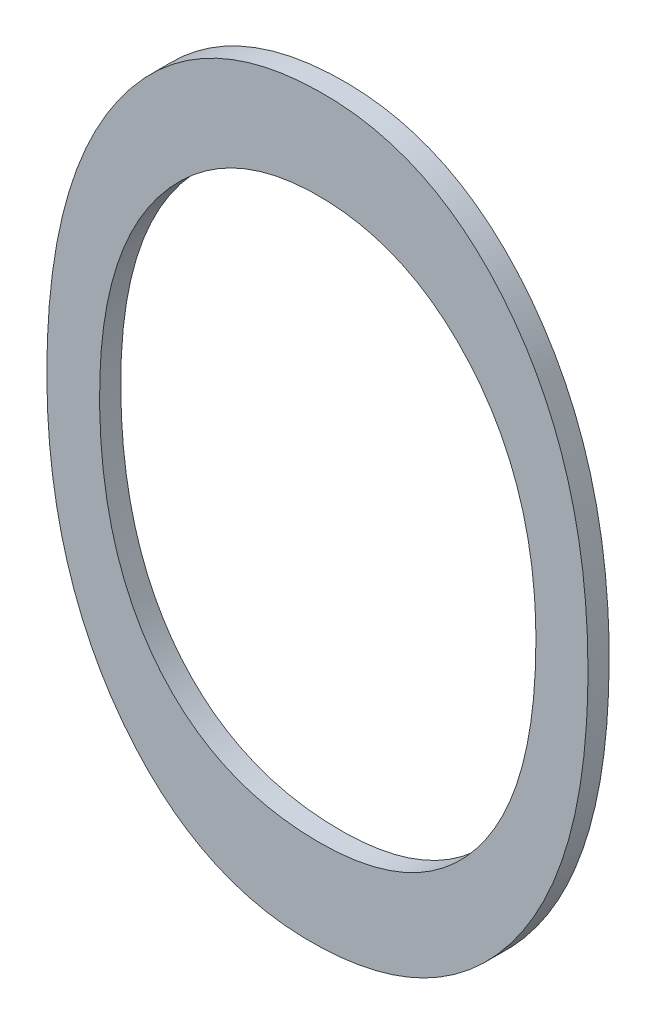
ISO-10303-21;
HEADER;
FILE_DESCRIPTION(('STEP AP214'),'2;1');
FILE_NAME('part.step','',(''),(''),'','','');
FILE_SCHEMA(('AUTOMOTIVE_DESIGN { 1 0 10303 214 1 1 1 1 }'));
ENDSEC;
DATA;
#1=APPLICATION_CONTEXT('core data for automotive mechanical design processes');
#2=APPLICATION_PROTOCOL_DEFINITION('international standard','automotive_design',2000,#1);
#3=PRODUCT_CONTEXT('',#1,'mechanical');
#4=PRODUCT('Part','Part','',(#3));
#5=PRODUCT_RELATED_PRODUCT_CATEGORY('part','',(#4));
#6=PRODUCT_DEFINITION_FORMATION('','',#4);
#7=PRODUCT_DEFINITION_CONTEXT('part definition',#1,'design');
#8=PRODUCT_DEFINITION('design','',#6,#7);
#9=PRODUCT_DEFINITION_SHAPE('','',#8);
#10=(LENGTH_UNIT() NAMED_UNIT(*) SI_UNIT(.MILLI.,.METRE.));
#11=(NAMED_UNIT(*) PLANE_ANGLE_UNIT() SI_UNIT($,.RADIAN.));
#12=(NAMED_UNIT(*) SI_UNIT($,.STERADIAN.) SOLID_ANGLE_UNIT());
#13=UNCERTAINTY_MEASURE_WITH_UNIT(LENGTH_MEASURE(1.E-05),#10,'distance_accuracy_value','');
#14=(GEOMETRIC_REPRESENTATION_CONTEXT(3) GLOBAL_UNCERTAINTY_ASSIGNED_CONTEXT((#13)) GLOBAL_UNIT_ASSIGNED_CONTEXT((#10,
#11,#12)) REPRESENTATION_CONTEXT('',''));
#15=CARTESIAN_POINT('',(0.,0.,0.));
#16=DIRECTION('',(0.,0.,1.));
#17=DIRECTION('',(1.,0.,0.));
#18=AXIS2_PLACEMENT_3D('',#15,#16,#17);
#19=CARTESIAN_POINT('',(-8.95983005625009,-22.770458436575,135.210489149433));
#20=DIRECTION('',(0.,0.,-1.));
#21=DIRECTION('',(0.,-1.,0.));
#22=AXIS2_PLACEMENT_3D('',#19,#20,#21);
#23=PLANE('',#22);
#24=CARTESIAN_POINT('',(-6.29001147151449,-57.2036649498082,135.210489149433));
#25=CARTESIAN_POINT('',(-6.29001147151449,-55.6376905619951,135.210489149433));
#26=CARTESIAN_POINT('',(-6.63960220039776,-54.3794038707565,135.210489149433));
#27=CARTESIAN_POINT('',(-8.03796444627411,-52.478205511647,135.210489149433));
#28=CARTESIAN_POINT('',(-8.936683522284,-52.0029061569471,135.210489149433));
#29=CARTESIAN_POINT('',(-11.2257835823802,-52.0029061569471,135.210489149433));
#30=CARTESIAN_POINT('',(-12.1771811794543,-52.4877831662802,135.210489149433));
#31=CARTESIAN_POINT('',(-13.6010836890156,-54.4272929883774,135.210489149433));
#32=CARTESIAN_POINT('',(-13.9570599991587,-55.7382577194471,135.210489149433));
#33=CARTESIAN_POINT('',(-13.9570599991587,-58.9228839979575,135.210489149433));
#34=CARTESIAN_POINT('',(-13.6090662372385,-60.1572263373725,135.210489149433));
#35=CARTESIAN_POINT('',(-12.2170884201205,-62.029690826383,135.210489149433));
#36=CARTESIAN_POINT('',(-11.3199653987747,-62.4978073738942,135.210489149433));
#37=CARTESIAN_POINT('',(-9.03725067973593,-62.4978073738942,135.210489149433));
#38=CARTESIAN_POINT('',(-8.08585302825645,-62.0249019505825,135.210489149433));
#39=CARTESIAN_POINT('',(-6.64917989098564,-60.1332815715753,135.210489149433));
#40=CARTESIAN_POINT('',(-6.29001147151449,-58.8414728636778,135.210489149433));
#41=CARTESIAN_POINT('',(-6.29001147151449,-57.2036649498082,135.210489149433));
#42=(BOUNDED_CURVE() B_SPLINE_CURVE(3,(#24,#25,#26,#27,#28,#29,#30,#31,#32,#33,#34,#35,#36,#37,
#38,#39,#40,#41),.UNSPECIFIED.,.T.,.F.) B_SPLINE_CURVE_WITH_KNOTS((4,2,2,2,2,2,2,2,4),(0.,
0.119769127317099,0.239538277576526,0.369404228018849,0.499270130659376,0.619725441865202,
0.740180683109994,0.870090292670561,1.),
.UNSPECIFIED.) CURVE() GEOMETRIC_REPRESENTATION_ITEM() RATIONAL_B_SPLINE_CURVE((1.,1.,1.,1.,1.,
1.,1.,1.,1.,1.,1.,1.,1.,1.,1.,1.,1.,1.)) REPRESENTATION_ITEM(''));
#43=CARTESIAN_POINT('',(-6.29001147151449,-57.2036649498082,135.210489149433));
#44=VERTEX_POINT('',#43);
#45=EDGE_CURVE('E11',#44,#44,#42,.T.);
#46=ORIENTED_EDGE('',*,*,#45,.T.);
#47=EDGE_LOOP('',(#46));
#48=FACE_BOUND('',#47,.T.);
#49=CARTESIAN_POINT('',(-7.02750395949526,-57.1964815551125,135.210489149433));
#50=CARTESIAN_POINT('',(-7.02750395949526,-58.4655430642311,135.210489149433));
#51=CARTESIAN_POINT('',(-7.3028661422954,-59.4532564299442,135.210489149433));
#52=CARTESIAN_POINT('',(-8.40431623413468,-60.8659851472965,135.210489149433));
#53=CARTESIAN_POINT('',(-9.1521845739667,-61.2191678005769,135.210489149433));
#54=CARTESIAN_POINT('',(-11.0741348188703,-61.2191678005769,135.210489149433));
#55=CARTESIAN_POINT('',(-11.8371686510976,-60.8779583881137,135.210489149433));
#56=CARTESIAN_POINT('',(-12.9354248849291,-59.5131172468882,135.210489149433));
#57=CARTESIAN_POINT('',(-13.2099896866587,-58.5469541985108,135.210489149433));
#58=CARTESIAN_POINT('',(-13.2099896866587,-56.0806647589427,135.210489149433));
#59=CARTESIAN_POINT('',(-12.9170677273582,-55.1085155913386,135.210489149433));
#60=CARTESIAN_POINT('',(-11.7453805625484,-53.6526862433177,135.210489149433));
#61=CARTESIAN_POINT('',(-11.0054936184378,-53.2887290986538,135.210489149433));
#62=CARTESIAN_POINT('',(-9.22082577439911,-53.2887290986538,135.210489149433));
#63=CARTESIAN_POINT('',(-8.48413167465649,-53.6431088090228,135.210489149433));
#64=CARTESIAN_POINT('',(-7.31882920586602,-55.0606264476446,135.210489149433));
#65=CARTESIAN_POINT('',(-7.02750395949526,-56.0088310750484,135.210489149433));
#66=CARTESIAN_POINT('',(-7.02750395949526,-57.1964815551125,135.210489149433));
#67=(BOUNDED_CURVE() B_SPLINE_CURVE(3,(#49,#50,#51,#52,#53,#54,#55,#56,#57,#58,#59,#60,#61,#62,
#63,#64,#65,#66),.UNSPECIFIED.,.T.,.F.) B_SPLINE_CURVE_WITH_KNOTS((4,2,2,2,2,2,2,2,4),(0.,
0.123691768703721,0.247383476288096,0.37525395335185,0.503124425762321,0.627565480981364,
0.752006596553877,0.876003296869422,1.),
.UNSPECIFIED.) CURVE() GEOMETRIC_REPRESENTATION_ITEM() RATIONAL_B_SPLINE_CURVE((1.,1.,1.,1.,1.,
1.,1.,1.,1.,1.,1.,1.,1.,1.,1.,1.,1.,1.)) REPRESENTATION_ITEM(''));
#68=CARTESIAN_POINT('',(-7.02750395949526,-57.1964815551125,135.210489149433));
#69=VERTEX_POINT('',#68);
#70=EDGE_CURVE('E46',#69,#69,#67,.T.);
#71=ORIENTED_EDGE('',*,*,#70,.T.);
#72=EDGE_LOOP('',(#71));
#73=FACE_BOUND('',#72,.T.);
#74=ADVANCED_FACE('F42',(#48,#73),#23,.F.);
#75=CARTESIAN_POINT('',(-6.29001147151449,-57.2036649498082,135.410489149433));
#76=CARTESIAN_POINT('',(-6.29001147151449,-55.6376905619951,135.410489149433));
#77=CARTESIAN_POINT('',(-6.63960220039776,-54.3794038707565,135.410489149433));
#78=CARTESIAN_POINT('',(-8.03796444627411,-52.478205511647,135.410489149433));
#79=CARTESIAN_POINT('',(-8.936683522284,-52.0029061569471,135.410489149433));
#80=CARTESIAN_POINT('',(-11.2257835823802,-52.0029061569471,135.410489149433));
#81=CARTESIAN_POINT('',(-12.1771811794543,-52.4877831662802,135.410489149433));
#82=CARTESIAN_POINT('',(-13.6010836890156,-54.4272929883774,135.410489149433));
#83=CARTESIAN_POINT('',(-13.9570599991587,-55.7382577194471,135.410489149433));
#84=CARTESIAN_POINT('',(-13.9570599991587,-58.9228839979575,135.410489149433));
#85=CARTESIAN_POINT('',(-13.6090662372385,-60.1572263373725,135.410489149433));
#86=CARTESIAN_POINT('',(-12.2170884201205,-62.029690826383,135.410489149433));
#87=CARTESIAN_POINT('',(-11.3199653987747,-62.4978073738942,135.410489149433));
#88=CARTESIAN_POINT('',(-9.03725067973593,-62.4978073738942,135.410489149433));
#89=CARTESIAN_POINT('',(-8.08585302825645,-62.0249019505825,135.410489149433));
#90=CARTESIAN_POINT('',(-6.64917989098564,-60.1332815715753,135.410489149433));
#91=CARTESIAN_POINT('',(-6.29001147151449,-58.8414728636778,135.410489149433));
#92=CARTESIAN_POINT('',(-6.29001147151449,-57.2036649498082,135.410489149433));
#93=(BOUNDED_CURVE() B_SPLINE_CURVE(3,(#75,#76,#77,#78,#79,#80,#81,#82,#83,#84,#85,#86,#87,#88,
#89,#90,#91,#92),.UNSPECIFIED.,.T.,.F.) B_SPLINE_CURVE_WITH_KNOTS((4,2,2,2,2,2,2,2,4),(0.,
0.119769127317099,0.239538277576526,0.369404228018849,0.499270130659376,0.619725441865202,
0.740180683109994,0.870090292670561,1.),
.UNSPECIFIED.) CURVE() GEOMETRIC_REPRESENTATION_ITEM() RATIONAL_B_SPLINE_CURVE((1.,1.,1.,1.,1.,
1.,1.,1.,1.,1.,1.,1.,1.,1.,1.,1.,1.,1.)) REPRESENTATION_ITEM(''));
#94=DIRECTION('',(0.,0.,-1.));
#95=VECTOR('',#94,1.);
#96=SURFACE_OF_LINEAR_EXTRUSION('',#93,#95);
#97=ORIENTED_EDGE('',*,*,#45,.F.);
#98=EDGE_LOOP('',(#97));
#99=FACE_BOUND('',#98,.T.);
#100=CARTESIAN_POINT('',(-6.29001147151449,-57.2036649498082,134.910489149433));
#101=CARTESIAN_POINT('',(-6.29001147151449,-58.8414728636778,134.910489149433));
#102=CARTESIAN_POINT('',(-6.64917989098564,-60.1332815715753,134.910489149433));
#103=CARTESIAN_POINT('',(-8.08585302825645,-62.0249019505825,134.910489149433));
#104=CARTESIAN_POINT('',(-9.03725067973593,-62.4978073738942,134.910489149433));
#105=CARTESIAN_POINT('',(-11.3199653987747,-62.4978073738942,134.910489149433));
#106=CARTESIAN_POINT('',(-12.2170884201205,-62.029690826383,134.910489149433));
#107=CARTESIAN_POINT('',(-13.6090662372385,-60.1572263373725,134.910489149433));
#108=CARTESIAN_POINT('',(-13.9570599991587,-58.9228839979575,134.910489149433));
#109=CARTESIAN_POINT('',(-13.9570599991587,-55.7382577194471,134.910489149433));
#110=CARTESIAN_POINT('',(-13.6010836890156,-54.4272929883774,134.910489149433));
#111=CARTESIAN_POINT('',(-12.1771811794543,-52.4877831662802,134.910489149433));
#112=CARTESIAN_POINT('',(-11.2257835823802,-52.0029061569471,134.910489149433));
#113=CARTESIAN_POINT('',(-8.936683522284,-52.0029061569471,134.910489149433));
#114=CARTESIAN_POINT('',(-8.03796444627411,-52.478205511647,134.910489149433));
#115=CARTESIAN_POINT('',(-6.63960220039776,-54.3794038707565,134.910489149433));
#116=CARTESIAN_POINT('',(-6.29001147151449,-55.6376905619951,134.910489149433));
#117=CARTESIAN_POINT('',(-6.29001147151449,-57.2036649498082,134.910489149433));
#118=(BOUNDED_CURVE() B_SPLINE_CURVE(3,(#100,#101,#102,#103,#104,#105,#106,#107,#108,#109,#110,
#111,#112,#113,#114,#115,#116,#117),.UNSPECIFIED.,.T.,.F.) B_SPLINE_CURVE_WITH_KNOTS((4,2,2,2,2,
2,2,2,4),(0.,0.129909707329439,0.259819316890006,0.380274558134798,0.500729869340624,
0.630595771981151,0.760461722423474,0.880230872682901,1.),
.UNSPECIFIED.) CURVE() GEOMETRIC_REPRESENTATION_ITEM() RATIONAL_B_SPLINE_CURVE((1.,1.,1.,1.,1.,
1.,1.,1.,1.,1.,1.,1.,1.,1.,1.,1.,1.,1.)) REPRESENTATION_ITEM(''));
#119=CARTESIAN_POINT('',(-6.29001147151449,-57.2036649498082,134.910489149433));
#120=VERTEX_POINT('',#119);
#121=EDGE_CURVE('E54',#120,#120,#118,.T.);
#122=ORIENTED_EDGE('',*,*,#121,.F.);
#123=EDGE_LOOP('',(#122));
#124=FACE_BOUND('',#123,.T.);
#125=ADVANCED_FACE('F119',(#99,#124),#96,.F.);
#126=CARTESIAN_POINT('',(-13.9570216698443,-57.4182560853678,134.910489149433));
#127=DIRECTION('',(0.,0.,1.));
#128=DIRECTION('',(1.,0.,0.));
#129=AXIS2_PLACEMENT_3D('',#126,#127,#128);
#130=PLANE('',#129);
#131=ORIENTED_EDGE('',*,*,#121,.T.);
#132=EDGE_LOOP('',(#131));
#133=FACE_BOUND('',#132,.T.);
#134=CARTESIAN_POINT('',(-7.02750395949526,-57.1964815551125,134.910489149433));
#135=CARTESIAN_POINT('',(-7.02750395949526,-56.0088310750484,134.910489149433));
#136=CARTESIAN_POINT('',(-7.31882920586602,-55.0606264476446,134.910489149433));
#137=CARTESIAN_POINT('',(-8.48413167465649,-53.6431088090228,134.910489149433));
#138=CARTESIAN_POINT('',(-9.22082577439911,-53.2887290986538,134.910489149433));
#139=CARTESIAN_POINT('',(-11.0054936184378,-53.2887290986538,134.910489149433));
#140=CARTESIAN_POINT('',(-11.7453805625484,-53.6526862433177,134.910489149433));
#141=CARTESIAN_POINT('',(-12.9170677273582,-55.1085155913386,134.910489149433));
#142=CARTESIAN_POINT('',(-13.2099896866587,-56.0806647589427,134.910489149433));
#143=CARTESIAN_POINT('',(-13.2099896866587,-58.5469541985108,134.910489149433));
#144=CARTESIAN_POINT('',(-12.9354248849291,-59.5131172468882,134.910489149433));
#145=CARTESIAN_POINT('',(-11.8371686510976,-60.8779583881137,134.910489149433));
#146=CARTESIAN_POINT('',(-11.0741348188703,-61.2191678005769,134.910489149433));
#147=CARTESIAN_POINT('',(-9.1521845739667,-61.2191678005769,134.910489149433));
#148=CARTESIAN_POINT('',(-8.40431623413468,-60.8659851472965,134.910489149433));
#149=CARTESIAN_POINT('',(-7.3028661422954,-59.4532564299442,134.910489149433));
#150=CARTESIAN_POINT('',(-7.02750395949526,-58.4655430642311,134.910489149433));
#151=CARTESIAN_POINT('',(-7.02750395949526,-57.1964815551125,134.910489149433));
#152=(BOUNDED_CURVE() B_SPLINE_CURVE(3,(#134,#135,#136,#137,#138,#139,#140,#141,#142,#143,#144,
#145,#146,#147,#148,#149,#150,#151),.UNSPECIFIED.,.T.,.F.) B_SPLINE_CURVE_WITH_KNOTS((4,2,2,2,2,
2,2,2,4),(0.,0.123996703130578,0.247993403446123,0.372434519018636,0.496875574237679,
0.62474604664815,0.752616523711904,0.876308231296279,1.),
.UNSPECIFIED.) CURVE() GEOMETRIC_REPRESENTATION_ITEM() RATIONAL_B_SPLINE_CURVE((1.,1.,1.,1.,1.,
1.,1.,1.,1.,1.,1.,1.,1.,1.,1.,1.,1.,1.)) REPRESENTATION_ITEM(''));
#153=CARTESIAN_POINT('',(-7.02750395949526,-57.1964815551125,134.910489149433));
#154=VERTEX_POINT('',#153);
#155=EDGE_CURVE('E77',#154,#154,#152,.T.);
#156=ORIENTED_EDGE('',*,*,#155,.T.);
#157=EDGE_LOOP('',(#156));
#158=FACE_BOUND('',#157,.T.);
#159=ADVANCED_FACE('F44',(#133,#158),#130,.F.);
#160=CARTESIAN_POINT('',(-7.02750395949526,-57.1964815551125,135.410489149433));
#161=CARTESIAN_POINT('',(-7.02750395949526,-58.4655430642311,135.410489149433));
#162=CARTESIAN_POINT('',(-7.3028661422954,-59.4532564299442,135.410489149433));
#163=CARTESIAN_POINT('',(-8.40431623413468,-60.8659851472965,135.410489149433));
#164=CARTESIAN_POINT('',(-9.1521845739667,-61.2191678005769,135.410489149433));
#165=CARTESIAN_POINT('',(-11.0741348188703,-61.2191678005769,135.410489149433));
#166=CARTESIAN_POINT('',(-11.8371686510976,-60.8779583881137,135.410489149433));
#167=CARTESIAN_POINT('',(-12.9354248849291,-59.5131172468882,135.410489149433));
#168=CARTESIAN_POINT('',(-13.2099896866587,-58.5469541985108,135.410489149433));
#169=CARTESIAN_POINT('',(-13.2099896866587,-56.0806647589427,135.410489149433));
#170=CARTESIAN_POINT('',(-12.9170677273582,-55.1085155913386,135.410489149433));
#171=CARTESIAN_POINT('',(-11.7453805625484,-53.6526862433177,135.410489149433));
#172=CARTESIAN_POINT('',(-11.0054936184378,-53.2887290986538,135.410489149433));
#173=CARTESIAN_POINT('',(-9.22082577439911,-53.2887290986538,135.410489149433));
#174=CARTESIAN_POINT('',(-8.48413167465649,-53.6431088090228,135.410489149433));
#175=CARTESIAN_POINT('',(-7.31882920586602,-55.0606264476446,135.410489149433));
#176=CARTESIAN_POINT('',(-7.02750395949526,-56.0088310750484,135.410489149433));
#177=CARTESIAN_POINT('',(-7.02750395949526,-57.1964815551125,135.410489149433));
#178=(BOUNDED_CURVE() B_SPLINE_CURVE(3,(#160,#161,#162,#163,#164,#165,#166,#167,#168,#169,#170,
#171,#172,#173,#174,#175,#176,#177),.UNSPECIFIED.,.T.,.F.) B_SPLINE_CURVE_WITH_KNOTS((4,2,2,2,2,
2,2,2,4),(0.,0.123691768703721,0.247383476288096,0.37525395335185,0.503124425762321,
0.627565480981364,0.752006596553877,0.876003296869422,1.),
.UNSPECIFIED.) CURVE() GEOMETRIC_REPRESENTATION_ITEM() RATIONAL_B_SPLINE_CURVE((1.,1.,1.,1.,1.,
1.,1.,1.,1.,1.,1.,1.,1.,1.,1.,1.,1.,1.)) REPRESENTATION_ITEM(''));
#179=DIRECTION('',(0.,0.,-1.));
#180=VECTOR('',#179,1.);
#181=SURFACE_OF_LINEAR_EXTRUSION('',#178,#180);
#182=ORIENTED_EDGE('',*,*,#70,.F.);
#183=EDGE_LOOP('',(#182));
#184=FACE_BOUND('',#183,.T.);
#185=ORIENTED_EDGE('',*,*,#155,.F.);
#186=EDGE_LOOP('',(#185));
#187=FACE_BOUND('',#186,.T.);
#188=ADVANCED_FACE('F109',(#184,#187),#181,.F.);
#189=CLOSED_SHELL('',(#74,#125,#159,#188));
#190=MANIFOLD_SOLID_BREP('B2',#189);
#191=ADVANCED_BREP_SHAPE_REPRESENTATION('',(#18,#190),#14);
#192=SHAPE_DEFINITION_REPRESENTATION(#9,#191);
ENDSEC;
END-ISO-10303-21;
